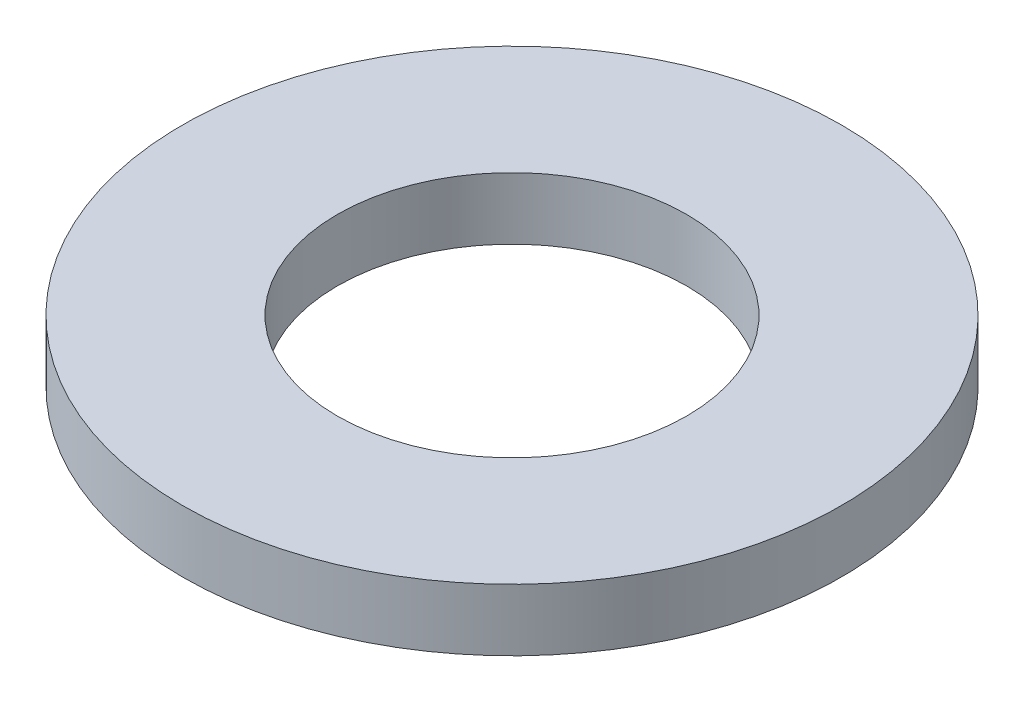
ISO-10303-21;
HEADER;
FILE_DESCRIPTION(('STEP AP214'),'2;1');
FILE_NAME('part.step','',(''),(''),'','','');
FILE_SCHEMA(('AUTOMOTIVE_DESIGN { 1 0 10303 214 1 1 1 1 }'));
ENDSEC;
DATA;
#1=APPLICATION_CONTEXT('core data for automotive mechanical design processes');
#2=APPLICATION_PROTOCOL_DEFINITION('international standard','automotive_design',2000,#1);
#3=PRODUCT_CONTEXT('',#1,'mechanical');
#4=PRODUCT('Part','Part','',(#3));
#5=PRODUCT_RELATED_PRODUCT_CATEGORY('part','',(#4));
#6=PRODUCT_DEFINITION_FORMATION('','',#4);
#7=PRODUCT_DEFINITION_CONTEXT('part definition',#1,'design');
#8=PRODUCT_DEFINITION('design','',#6,#7);
#9=PRODUCT_DEFINITION_SHAPE('','',#8);
#10=(LENGTH_UNIT() NAMED_UNIT(*) SI_UNIT(.MILLI.,.METRE.));
#11=(NAMED_UNIT(*) PLANE_ANGLE_UNIT() SI_UNIT($,.RADIAN.));
#12=(NAMED_UNIT(*) SI_UNIT($,.STERADIAN.) SOLID_ANGLE_UNIT());
#13=UNCERTAINTY_MEASURE_WITH_UNIT(LENGTH_MEASURE(1.E-05),#10,'distance_accuracy_value','');
#14=(GEOMETRIC_REPRESENTATION_CONTEXT(3) GLOBAL_UNCERTAINTY_ASSIGNED_CONTEXT((#13)) GLOBAL_UNIT_ASSIGNED_CONTEXT((#10,
#11,#12)) REPRESENTATION_CONTEXT('',''));
#15=CARTESIAN_POINT('',(0.,0.,0.));
#16=DIRECTION('',(0.,0.,1.));
#17=DIRECTION('',(1.,0.,0.));
#18=AXIS2_PLACEMENT_3D('',#15,#16,#17);
#19=CARTESIAN_POINT('',(0.,0.94,0.));
#20=DIRECTION('',(0.,1.,0.));
#21=DIRECTION('',(0.,0.,1.));
#22=AXIS2_PLACEMENT_3D('',#19,#20,#21);
#23=PLANE('',#22);
#24=CARTESIAN_POINT('',(0.,0.94,0.));
#25=DIRECTION('',(0.,1.,0.));
#26=DIRECTION('',(0.,0.,1.));
#27=AXIS2_PLACEMENT_3D('',#24,#25,#26);
#28=CIRCLE('',#27,5.);
#29=CARTESIAN_POINT('',(0.,0.94,5.));
#30=VERTEX_POINT('',#29);
#31=EDGE_CURVE('E10',#30,#30,#28,.T.);
#32=ORIENTED_EDGE('',*,*,#31,.T.);
#33=EDGE_LOOP('',(#32));
#34=FACE_BOUND('',#33,.T.);
#35=CARTESIAN_POINT('',(0.,0.94,0.));
#36=DIRECTION('',(0.,1.,0.));
#37=DIRECTION('',(0.,0.,1.));
#38=AXIS2_PLACEMENT_3D('',#35,#36,#37);
#39=CIRCLE('',#38,2.65);
#40=CARTESIAN_POINT('',(0.,0.94,2.65));
#41=VERTEX_POINT('',#40);
#42=EDGE_CURVE('E53',#41,#41,#39,.T.);
#43=ORIENTED_EDGE('',*,*,#42,.F.);
#44=EDGE_LOOP('',(#43));
#45=FACE_BOUND('',#44,.T.);
#46=ADVANCED_FACE('F39',(#34,#45),#23,.T.);
#47=CARTESIAN_POINT('',(0.,0.,0.));
#48=DIRECTION('',(0.,1.,0.));
#49=DIRECTION('',(0.,0.,1.));
#50=AXIS2_PLACEMENT_3D('',#47,#48,#49);
#51=PLANE('',#50);
#52=CARTESIAN_POINT('',(0.,0.,0.));
#53=DIRECTION('',(0.,1.,0.));
#54=DIRECTION('',(0.,0.,1.));
#55=AXIS2_PLACEMENT_3D('',#52,#53,#54);
#56=CIRCLE('',#55,5.);
#57=CARTESIAN_POINT('',(0.,0.,5.));
#58=VERTEX_POINT('',#57);
#59=EDGE_CURVE('E43',#58,#58,#56,.T.);
#60=ORIENTED_EDGE('',*,*,#59,.F.);
#61=EDGE_LOOP('',(#60));
#62=FACE_BOUND('',#61,.T.);
#63=CARTESIAN_POINT('',(0.,0.,0.));
#64=DIRECTION('',(0.,1.,0.));
#65=DIRECTION('',(0.,0.,1.));
#66=AXIS2_PLACEMENT_3D('',#63,#64,#65);
#67=CIRCLE('',#66,2.65);
#68=CARTESIAN_POINT('',(0.,0.,2.65));
#69=VERTEX_POINT('',#68);
#70=EDGE_CURVE('E55',#69,#69,#67,.T.);
#71=ORIENTED_EDGE('',*,*,#70,.T.);
#72=EDGE_LOOP('',(#71));
#73=FACE_BOUND('',#72,.T.);
#74=ADVANCED_FACE('F66',(#62,#73),#51,.F.);
#75=CARTESIAN_POINT('',(0.,0.94,0.));
#76=DIRECTION('',(0.,-1.,0.));
#77=DIRECTION('',(0.,0.,-1.));
#78=AXIS2_PLACEMENT_3D('',#75,#76,#77);
#79=CYLINDRICAL_SURFACE('',#78,5.);
#80=ORIENTED_EDGE('',*,*,#31,.F.);
#81=EDGE_LOOP('',(#80));
#82=FACE_BOUND('',#81,.T.);
#83=ORIENTED_EDGE('',*,*,#59,.T.);
#84=EDGE_LOOP('',(#83));
#85=FACE_BOUND('',#84,.T.);
#86=ADVANCED_FACE('F41',(#82,#85),#79,.T.);
#87=CARTESIAN_POINT('',(0.,0.94,0.));
#88=DIRECTION('',(0.,-1.,0.));
#89=DIRECTION('',(0.,0.,-1.));
#90=AXIS2_PLACEMENT_3D('',#87,#88,#89);
#91=CYLINDRICAL_SURFACE('',#90,2.65);
#92=ORIENTED_EDGE('',*,*,#42,.T.);
#93=EDGE_LOOP('',(#92));
#94=FACE_BOUND('',#93,.T.);
#95=ORIENTED_EDGE('',*,*,#70,.F.);
#96=EDGE_LOOP('',(#95));
#97=FACE_BOUND('',#96,.T.);
#98=ADVANCED_FACE('F62',(#94,#97),#91,.F.);
#99=CLOSED_SHELL('',(#46,#74,#86,#98));
#100=MANIFOLD_SOLID_BREP('B2',#99);
#101=ADVANCED_BREP_SHAPE_REPRESENTATION('',(#18,#100),#14);
#102=SHAPE_DEFINITION_REPRESENTATION(#9,#101);
ENDSEC;
END-ISO-10303-21;
